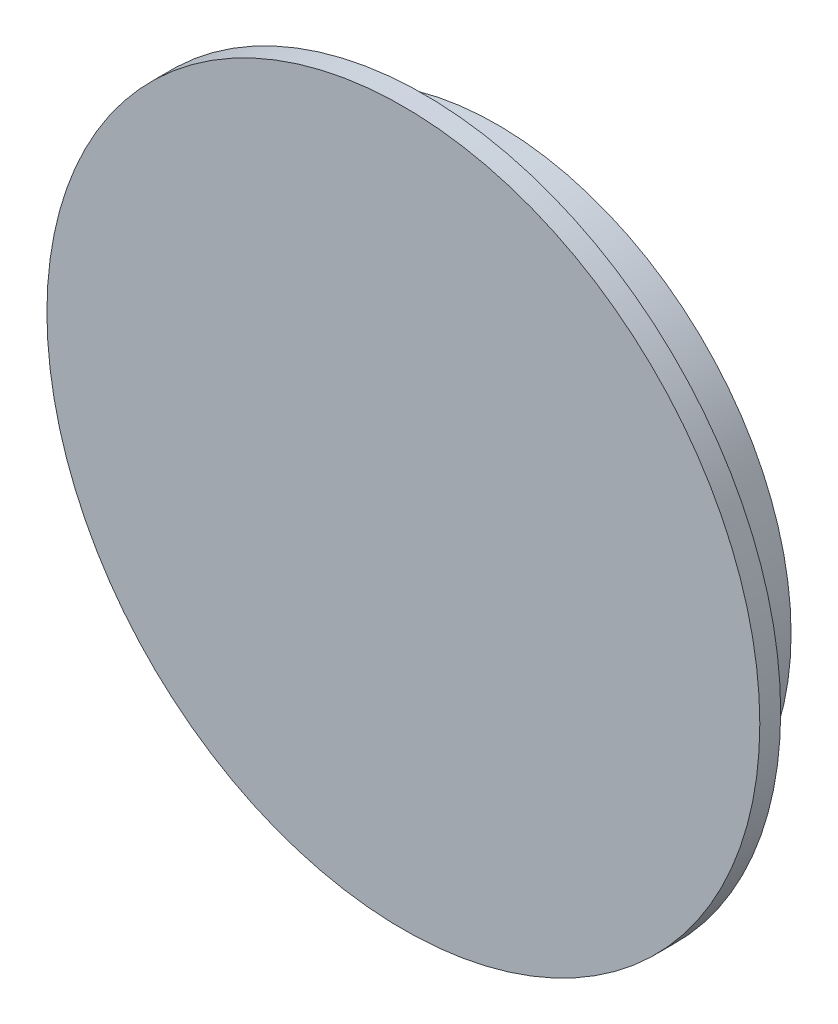
ISO-10303-21;
HEADER;
FILE_DESCRIPTION(('STEP AP214'),'2;1');
FILE_NAME('part.step','',(''),(''),'','','');
FILE_SCHEMA(('AUTOMOTIVE_DESIGN { 1 0 10303 214 1 1 1 1 }'));
ENDSEC;
DATA;
#1=APPLICATION_CONTEXT('core data for automotive mechanical design processes');
#2=APPLICATION_PROTOCOL_DEFINITION('international standard','automotive_design',2000,#1);
#3=PRODUCT_CONTEXT('',#1,'mechanical');
#4=PRODUCT('Part','Part','',(#3));
#5=PRODUCT_RELATED_PRODUCT_CATEGORY('part','',(#4));
#6=PRODUCT_DEFINITION_FORMATION('','',#4);
#7=PRODUCT_DEFINITION_CONTEXT('part definition',#1,'design');
#8=PRODUCT_DEFINITION('design','',#6,#7);
#9=PRODUCT_DEFINITION_SHAPE('','',#8);
#10=(LENGTH_UNIT() NAMED_UNIT(*) SI_UNIT(.MILLI.,.METRE.));
#11=(NAMED_UNIT(*) PLANE_ANGLE_UNIT() SI_UNIT($,.RADIAN.));
#12=(NAMED_UNIT(*) SI_UNIT($,.STERADIAN.) SOLID_ANGLE_UNIT());
#13=UNCERTAINTY_MEASURE_WITH_UNIT(LENGTH_MEASURE(1.E-05),#10,'distance_accuracy_value','');
#14=(GEOMETRIC_REPRESENTATION_CONTEXT(3) GLOBAL_UNCERTAINTY_ASSIGNED_CONTEXT((#13)) GLOBAL_UNIT_ASSIGNED_CONTEXT((#10,
#11,#12)) REPRESENTATION_CONTEXT('',''));
#15=CARTESIAN_POINT('',(0.,0.,0.));
#16=DIRECTION('',(0.,0.,1.));
#17=DIRECTION('',(1.,0.,0.));
#18=AXIS2_PLACEMENT_3D('',#15,#16,#17);
#19=CARTESIAN_POINT('',(0.,0.,3.5));
#20=DIRECTION('',(0.,0.,-1.));
#21=DIRECTION('',(-1.,0.,0.));
#22=AXIS2_PLACEMENT_3D('',#19,#20,#21);
#23=CYLINDRICAL_SURFACE('',#22,12.6);
#24=CARTESIAN_POINT('',(0.,0.,3.5));
#25=DIRECTION('',(0.,0.,1.));
#26=DIRECTION('',(1.,0.,0.));
#27=AXIS2_PLACEMENT_3D('',#24,#25,#26);
#28=CIRCLE('',#27,12.6);
#29=CARTESIAN_POINT('',(12.6,0.,3.5));
#30=VERTEX_POINT('',#29);
#31=EDGE_CURVE('E54',#30,#30,#28,.T.);
#32=ORIENTED_EDGE('',*,*,#31,.T.);
#33=EDGE_LOOP('',(#32));
#34=FACE_BOUND('',#33,.T.);
#35=CARTESIAN_POINT('',(0.,0.,0.));
#36=DIRECTION('',(0.,0.,1.));
#37=DIRECTION('',(1.,0.,0.));
#38=AXIS2_PLACEMENT_3D('',#35,#36,#37);
#39=CIRCLE('',#38,12.6);
#40=CARTESIAN_POINT('',(12.6,0.,0.));
#41=VERTEX_POINT('',#40);
#42=EDGE_CURVE('E52',#41,#41,#39,.T.);
#43=ORIENTED_EDGE('',*,*,#42,.F.);
#44=EDGE_LOOP('',(#43));
#45=FACE_BOUND('',#44,.T.);
#46=ADVANCED_FACE('F41',(#34,#45),#23,.F.);
#47=CARTESIAN_POINT('',(0.,0.,3.5));
#48=DIRECTION('',(0.,0.,-1.));
#49=DIRECTION('',(-1.,0.,0.));
#50=AXIS2_PLACEMENT_3D('',#47,#48,#49);
#51=CYLINDRICAL_SURFACE('',#50,14.1);
#52=CARTESIAN_POINT('',(0.,0.,3.5));
#53=DIRECTION('',(0.,0.,1.));
#54=DIRECTION('',(1.,0.,0.));
#55=AXIS2_PLACEMENT_3D('',#52,#53,#54);
#56=CIRCLE('',#55,14.1);
#57=CARTESIAN_POINT('',(14.1,0.,3.5));
#58=VERTEX_POINT('',#57);
#59=EDGE_CURVE('E10',#58,#58,#56,.T.);
#60=ORIENTED_EDGE('',*,*,#59,.F.);
#61=EDGE_LOOP('',(#60));
#62=FACE_BOUND('',#61,.T.);
#63=CARTESIAN_POINT('',(0.,0.,0.));
#64=DIRECTION('',(0.,0.,1.));
#65=DIRECTION('',(1.,0.,0.));
#66=AXIS2_PLACEMENT_3D('',#63,#64,#65);
#67=CIRCLE('',#66,14.1);
#68=CARTESIAN_POINT('',(14.1,0.,0.));
#69=VERTEX_POINT('',#68);
#70=EDGE_CURVE('E44',#69,#69,#67,.T.);
#71=ORIENTED_EDGE('',*,*,#70,.T.);
#72=EDGE_LOOP('',(#71));
#73=FACE_BOUND('',#72,.T.);
#74=ADVANCED_FACE('F84',(#62,#73),#51,.T.);
#75=CARTESIAN_POINT('',(0.,0.,0.));
#76=DIRECTION('',(0.,0.,1.));
#77=DIRECTION('',(1.,0.,0.));
#78=AXIS2_PLACEMENT_3D('',#75,#76,#77);
#79=PLANE('',#78);
#80=ORIENTED_EDGE('',*,*,#42,.T.);
#81=EDGE_LOOP('',(#80));
#82=FACE_BOUND('',#81,.T.);
#83=ORIENTED_EDGE('',*,*,#70,.F.);
#84=EDGE_LOOP('',(#83));
#85=FACE_BOUND('',#84,.T.);
#86=ADVANCED_FACE('F76',(#82,#85),#79,.F.);
#87=CARTESIAN_POINT('',(0.,0.,3.5));
#88=DIRECTION('',(0.,0.,1.));
#89=DIRECTION('',(1.,0.,0.));
#90=AXIS2_PLACEMENT_3D('',#87,#88,#89);
#91=PLANE('',#90);
#92=ORIENTED_EDGE('',*,*,#59,.T.);
#93=EDGE_LOOP('',(#92));
#94=FACE_BOUND('',#93,.T.);
#95=CARTESIAN_POINT('',(0.,0.,3.5));
#96=DIRECTION('',(0.,0.,1.));
#97=DIRECTION('',(1.,0.,0.));
#98=AXIS2_PLACEMENT_3D('',#95,#96,#97);
#99=CIRCLE('',#98,17.1);
#100=CARTESIAN_POINT('',(17.1,0.,3.5));
#101=VERTEX_POINT('',#100);
#102=EDGE_CURVE('E64',#101,#101,#99,.T.);
#103=ORIENTED_EDGE('',*,*,#102,.F.);
#104=EDGE_LOOP('',(#103));
#105=FACE_BOUND('',#104,.T.);
#106=ADVANCED_FACE('F73',(#94,#105),#91,.F.);
#107=CARTESIAN_POINT('',(0.,0.,4.5));
#108=DIRECTION('',(0.,0.,1.));
#109=DIRECTION('',(1.,0.,0.));
#110=AXIS2_PLACEMENT_3D('',#107,#108,#109);
#111=PLANE('',#110);
#112=CARTESIAN_POINT('',(0.,0.,4.5));
#113=DIRECTION('',(0.,0.,1.));
#114=DIRECTION('',(1.,0.,0.));
#115=AXIS2_PLACEMENT_3D('',#112,#113,#114);
#116=CIRCLE('',#115,17.1);
#117=CARTESIAN_POINT('',(17.1,0.,4.5));
#118=VERTEX_POINT('',#117);
#119=EDGE_CURVE('E60',#118,#118,#116,.T.);
#120=ORIENTED_EDGE('',*,*,#119,.T.);
#121=EDGE_LOOP('',(#120));
#122=FACE_BOUND('',#121,.T.);
#123=ADVANCED_FACE('F75',(#122),#111,.T.);
#124=CARTESIAN_POINT('',(0.,0.,4.5));
#125=DIRECTION('',(0.,0.,-1.));
#126=DIRECTION('',(-1.,0.,0.));
#127=AXIS2_PLACEMENT_3D('',#124,#125,#126);
#128=CYLINDRICAL_SURFACE('',#127,17.1);
#129=ORIENTED_EDGE('',*,*,#119,.F.);
#130=EDGE_LOOP('',(#129));
#131=FACE_BOUND('',#130,.T.);
#132=ORIENTED_EDGE('',*,*,#102,.T.);
#133=EDGE_LOOP('',(#132));
#134=FACE_BOUND('',#133,.T.);
#135=ADVANCED_FACE('F71',(#131,#134),#128,.T.);
#136=ORIENTED_EDGE('',*,*,#31,.F.);
#137=EDGE_LOOP('',(#136));
#138=FACE_BOUND('',#137,.T.);
#139=ADVANCED_FACE('F78',(#138),#91,.F.);
#140=CLOSED_SHELL('',(#46,#74,#86,#106,#123,#135,#139));
#141=MANIFOLD_SOLID_BREP('B2',#140);
#142=ADVANCED_BREP_SHAPE_REPRESENTATION('',(#18,#141),#14);
#143=SHAPE_DEFINITION_REPRESENTATION(#9,#142);
ENDSEC;
END-ISO-10303-21;
